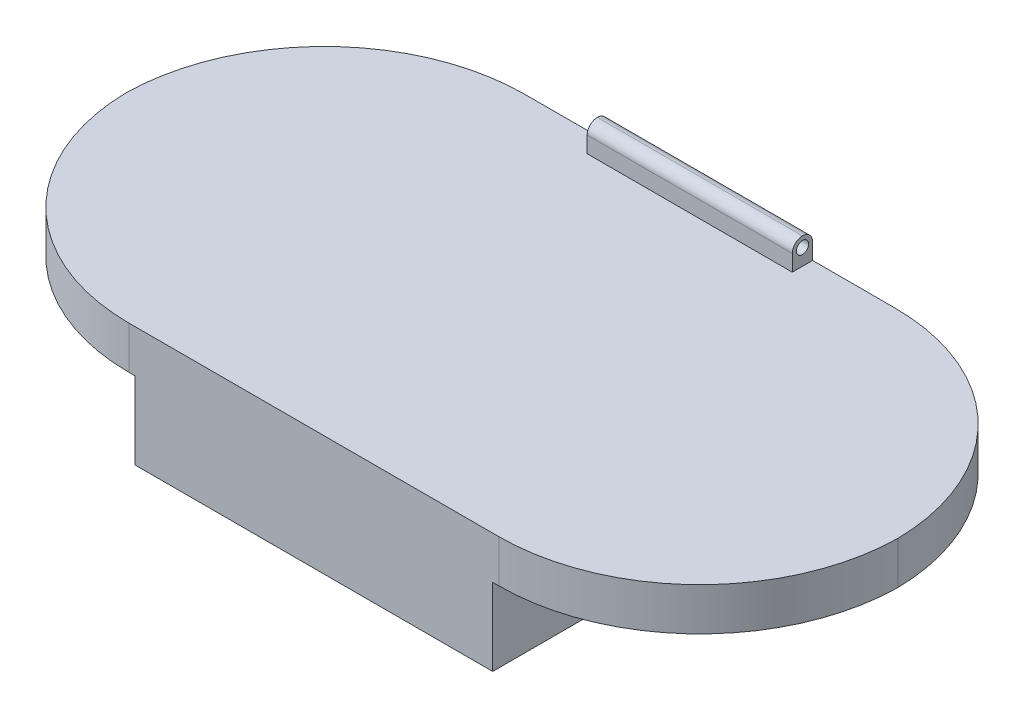
ISO-10303-21;
HEADER;
FILE_DESCRIPTION(('STEP AP214'),'2;1');
FILE_NAME('part.step','',(''),(''),'','','');
FILE_SCHEMA(('AUTOMOTIVE_DESIGN { 1 0 10303 214 1 1 1 1 }'));
ENDSEC;
DATA;
#1=APPLICATION_CONTEXT('core data for automotive mechanical design processes');
#2=APPLICATION_PROTOCOL_DEFINITION('international standard','automotive_design',2000,#1);
#3=PRODUCT_CONTEXT('',#1,'mechanical');
#4=PRODUCT('Part','Part','',(#3));
#5=PRODUCT_RELATED_PRODUCT_CATEGORY('part','',(#4));
#6=PRODUCT_DEFINITION_FORMATION('','',#4);
#7=PRODUCT_DEFINITION_CONTEXT('part definition',#1,'design');
#8=PRODUCT_DEFINITION('design','',#6,#7);
#9=PRODUCT_DEFINITION_SHAPE('','',#8);
#10=(LENGTH_UNIT() NAMED_UNIT(*) SI_UNIT(.MILLI.,.METRE.));
#11=(NAMED_UNIT(*) PLANE_ANGLE_UNIT() SI_UNIT($,.RADIAN.));
#12=(NAMED_UNIT(*) SI_UNIT($,.STERADIAN.) SOLID_ANGLE_UNIT());
#13=UNCERTAINTY_MEASURE_WITH_UNIT(LENGTH_MEASURE(1.E-05),#10,'distance_accuracy_value','');
#14=(GEOMETRIC_REPRESENTATION_CONTEXT(3) GLOBAL_UNCERTAINTY_ASSIGNED_CONTEXT((#13)) GLOBAL_UNIT_ASSIGNED_CONTEXT((#10,
#11,#12)) REPRESENTATION_CONTEXT('',''));
#15=CARTESIAN_POINT('',(0.,0.,0.));
#16=DIRECTION('',(0.,0.,1.));
#17=DIRECTION('',(1.,0.,0.));
#18=AXIS2_PLACEMENT_3D('',#15,#16,#17);
#19=CARTESIAN_POINT('',(0.,59.,0.));
#20=DIRECTION('',(0.,-1.,0.));
#21=DIRECTION('',(0.,0.,-1.));
#22=AXIS2_PLACEMENT_3D('',#19,#20,#21);
#23=PLANE('',#22);
#24=DIRECTION('',(0.,0.,1.));
#25=VECTOR('',#24,1.);
#26=CARTESIAN_POINT('',(-50.5,59.,-97.5));
#27=LINE('',#26,#25);
#28=CARTESIAN_POINT('',(-50.5,59.,-97.5));
#29=VERTEX_POINT('',#28);
#30=CARTESIAN_POINT('',(-50.5,59.,-87.5));
#31=VERTEX_POINT('',#30);
#32=EDGE_CURVE('E196',#29,#31,#27,.T.);
#33=ORIENTED_EDGE('',*,*,#32,.F.);
#34=DIRECTION('',(-1.,0.,0.));
#35=VECTOR('',#34,1.);
#36=CARTESIAN_POINT('',(190.,59.,-97.5));
#37=LINE('',#36,#35);
#38=CARTESIAN_POINT('',(-91.,59.,-97.5));
#39=VERTEX_POINT('',#38);
#40=EDGE_CURVE('E261',#29,#39,#37,.T.);
#41=ORIENTED_EDGE('',*,*,#40,.T.);
#42=CARTESIAN_POINT('',(-91.,59.,1.5));
#43=DIRECTION('',(0.,-1.,0.));
#44=DIRECTION('',(0.,0.,-1.));
#45=AXIS2_PLACEMENT_3D('',#42,#43,#44);
#46=CIRCLE('',#45,99.);
#47=CARTESIAN_POINT('',(-189.988635711378,59.,4.5775015722338E-13));
#48=VERTEX_POINT('',#47);
#49=EDGE_CURVE('E289',#39,#48,#46,.F.);
#50=ORIENTED_EDGE('',*,*,#49,.T.);
#51=CARTESIAN_POINT('',(-91.,59.,-1.5));
#52=DIRECTION('',(0.,-1.,0.));
#53=DIRECTION('',(0.,0.,-1.));
#54=AXIS2_PLACEMENT_3D('',#51,#52,#53);
#55=CIRCLE('',#54,99.);
#56=CARTESIAN_POINT('',(-91.,59.,97.5));
#57=VERTEX_POINT('',#56);
#58=EDGE_CURVE('E292',#48,#57,#55,.F.);
#59=ORIENTED_EDGE('',*,*,#58,.T.);
#60=DIRECTION('',(1.,0.,0.));
#61=VECTOR('',#60,1.);
#62=CARTESIAN_POINT('',(190.,59.,97.5));
#63=LINE('',#62,#61);
#64=CARTESIAN_POINT('',(91.,59.,97.5));
#65=VERTEX_POINT('',#64);
#66=EDGE_CURVE('E257',#57,#65,#63,.T.);
#67=ORIENTED_EDGE('',*,*,#66,.T.);
#68=CARTESIAN_POINT('',(91.,59.,-1.50000000000003));
#69=DIRECTION('',(0.,-1.,0.));
#70=DIRECTION('',(0.,0.,-1.));
#71=AXIS2_PLACEMENT_3D('',#68,#69,#70);
#72=CIRCLE('',#71,99.);
#73=CARTESIAN_POINT('',(189.988635711379,59.,0.));
#74=VERTEX_POINT('',#73);
#75=EDGE_CURVE('E283',#65,#74,#72,.F.);
#76=ORIENTED_EDGE('',*,*,#75,.T.);
#77=CARTESIAN_POINT('',(91.,59.,1.49999999999997));
#78=DIRECTION('',(0.,-1.,0.));
#79=DIRECTION('',(0.,0.,-1.));
#80=AXIS2_PLACEMENT_3D('',#77,#78,#79);
#81=CIRCLE('',#80,99.);
#82=CARTESIAN_POINT('',(91.,59.,-97.5));
#83=VERTEX_POINT('',#82);
#84=EDGE_CURVE('E286',#74,#83,#81,.F.);
#85=ORIENTED_EDGE('',*,*,#84,.T.);
#86=CARTESIAN_POINT('',(50.5,59.,-97.5));
#87=VERTEX_POINT('',#86);
#88=EDGE_CURVE('E189',#83,#87,#37,.T.);
#89=ORIENTED_EDGE('',*,*,#88,.T.);
#90=DIRECTION('',(0.,0.,-1.));
#91=VECTOR('',#90,1.);
#92=CARTESIAN_POINT('',(50.5,59.,-97.5));
#93=LINE('',#92,#91);
#94=CARTESIAN_POINT('',(50.5,59.,-87.5));
#95=VERTEX_POINT('',#94);
#96=EDGE_CURVE('E174',#95,#87,#93,.T.);
#97=ORIENTED_EDGE('',*,*,#96,.F.);
#98=DIRECTION('',(1.,0.,0.));
#99=VECTOR('',#98,1.);
#100=CARTESIAN_POINT('',(50.5,59.,-87.5));
#101=LINE('',#100,#99);
#102=EDGE_CURVE('E186',#31,#95,#101,.T.);
#103=ORIENTED_EDGE('',*,*,#102,.F.);
#104=EDGE_LOOP('',(#33,#41,#50,#59,#67,#76,#85,#89,#97,#103));
#105=FACE_BOUND('',#104,.T.);
#106=ADVANCED_FACE('F47',(#105),#23,.F.);
#107=CARTESIAN_POINT('',(190.,59.,97.5));
#108=DIRECTION('',(0.,0.,-1.));
#109=DIRECTION('',(-1.,0.,0.));
#110=AXIS2_PLACEMENT_3D('',#107,#108,#109);
#111=PLANE('',#110);
#112=ORIENTED_EDGE('',*,*,#66,.F.);
#113=DIRECTION('',(0.,-1.,0.));
#114=VECTOR('',#113,1.);
#115=CARTESIAN_POINT('',(-91.,59.,97.5));
#116=LINE('',#115,#114);
#117=CARTESIAN_POINT('',(-91.,38.,97.5));
#118=VERTEX_POINT('',#117);
#119=EDGE_CURVE('E273',#57,#118,#116,.T.);
#120=ORIENTED_EDGE('',*,*,#119,.T.);
#121=DIRECTION('',(-1.,0.,0.));
#122=VECTOR('',#121,1.);
#123=CARTESIAN_POINT('',(-88.0000000000001,38.,97.5));
#124=LINE('',#123,#122);
#125=CARTESIAN_POINT('',(-88.0000000000001,38.,97.5));
#126=VERTEX_POINT('',#125);
#127=EDGE_CURVE('E226',#126,#118,#124,.T.);
#128=ORIENTED_EDGE('',*,*,#127,.F.);
#129=DIRECTION('',(0.,-1.,0.));
#130=VECTOR('',#129,1.);
#131=CARTESIAN_POINT('',(-88.0000000000001,38.,97.5));
#132=LINE('',#131,#130);
#133=CARTESIAN_POINT('',(-88.0000000000001,0.,97.5));
#134=VERTEX_POINT('',#133);
#135=EDGE_CURVE('E210',#126,#134,#132,.T.);
#136=ORIENTED_EDGE('',*,*,#135,.T.);
#137=DIRECTION('',(1.,0.,0.));
#138=VECTOR('',#137,1.);
#139=CARTESIAN_POINT('',(190.,0.,97.5));
#140=LINE('',#139,#138);
#141=CARTESIAN_POINT('',(88.,0.,97.5));
#142=VERTEX_POINT('',#141);
#143=EDGE_CURVE('E253',#134,#142,#140,.T.);
#144=ORIENTED_EDGE('',*,*,#143,.T.);
#145=DIRECTION('',(0.,-1.,0.));
#146=VECTOR('',#145,1.);
#147=CARTESIAN_POINT('',(88.0000000000001,38.,97.5));
#148=LINE('',#147,#146);
#149=CARTESIAN_POINT('',(88.0000000000001,38.,97.5));
#150=VERTEX_POINT('',#149);
#151=EDGE_CURVE('E231',#150,#142,#148,.T.);
#152=ORIENTED_EDGE('',*,*,#151,.F.);
#153=DIRECTION('',(1.,0.,0.));
#154=VECTOR('',#153,1.);
#155=CARTESIAN_POINT('',(88.0000000000001,38.,97.5));
#156=LINE('',#155,#154);
#157=CARTESIAN_POINT('',(91.,38.,97.5));
#158=VERTEX_POINT('',#157);
#159=EDGE_CURVE('E249',#150,#158,#156,.T.);
#160=ORIENTED_EDGE('',*,*,#159,.T.);
#161=DIRECTION('',(0.,-1.,0.));
#162=VECTOR('',#161,1.);
#163=CARTESIAN_POINT('',(91.,59.,97.5));
#164=LINE('',#163,#162);
#165=EDGE_CURVE('E265',#158,#65,#164,.F.);
#166=ORIENTED_EDGE('',*,*,#165,.T.);
#167=EDGE_LOOP('',(#112,#120,#128,#136,#144,#152,#160,#166));
#168=FACE_BOUND('',#167,.T.);
#169=ADVANCED_FACE('F372',(#168),#111,.F.);
#170=CARTESIAN_POINT('',(190.,59.,-97.5));
#171=DIRECTION('',(0.,0.,1.));
#172=DIRECTION('',(1.,0.,0.));
#173=AXIS2_PLACEMENT_3D('',#170,#171,#172);
#174=PLANE('',#173);
#175=DIRECTION('',(0.,-1.,0.));
#176=VECTOR('',#175,1.);
#177=CARTESIAN_POINT('',(-50.5,72.,-97.5));
#178=LINE('',#177,#176);
#179=CARTESIAN_POINT('',(-50.5,67.,-97.5));
#180=VERTEX_POINT('',#179);
#181=EDGE_CURVE('E191',#180,#29,#178,.T.);
#182=ORIENTED_EDGE('',*,*,#181,.F.);
#183=DIRECTION('',(-1.,0.,0.));
#184=VECTOR('',#183,1.);
#185=CARTESIAN_POINT('',(190.,67.,-97.5));
#186=LINE('',#185,#184);
#187=CARTESIAN_POINT('',(50.5,67.,-97.5));
#188=VERTEX_POINT('',#187);
#189=EDGE_CURVE('E321',#180,#188,#186,.F.);
#190=ORIENTED_EDGE('',*,*,#189,.T.);
#191=DIRECTION('',(0.,-1.,0.));
#192=VECTOR('',#191,1.);
#193=CARTESIAN_POINT('',(50.5,72.,-97.5));
#194=LINE('',#193,#192);
#195=EDGE_CURVE('E180',#188,#87,#194,.T.);
#196=ORIENTED_EDGE('',*,*,#195,.T.);
#197=ORIENTED_EDGE('',*,*,#88,.F.);
#198=DIRECTION('',(0.,-1.,0.));
#199=VECTOR('',#198,1.);
#200=CARTESIAN_POINT('',(91.,59.,-97.5));
#201=LINE('',#200,#199);
#202=CARTESIAN_POINT('',(91.,38.,-97.5000000000001));
#203=VERTEX_POINT('',#202);
#204=EDGE_CURVE('E295',#83,#203,#201,.T.);
#205=ORIENTED_EDGE('',*,*,#204,.T.);
#206=DIRECTION('',(1.,0.,0.));
#207=VECTOR('',#206,1.);
#208=CARTESIAN_POINT('',(88.,38.,-97.5000000000001));
#209=LINE('',#208,#207);
#210=CARTESIAN_POINT('',(88.,38.,-97.5000000000001));
#211=VERTEX_POINT('',#210);
#212=EDGE_CURVE('E248',#211,#203,#209,.T.);
#213=ORIENTED_EDGE('',*,*,#212,.F.);
#214=DIRECTION('',(0.,1.,0.));
#215=VECTOR('',#214,1.);
#216=CARTESIAN_POINT('',(88.,38.,-97.5000000000001));
#217=LINE('',#216,#215);
#218=CARTESIAN_POINT('',(88.,0.,-97.5000000000001));
#219=VERTEX_POINT('',#218);
#220=EDGE_CURVE('E241',#219,#211,#217,.T.);
#221=ORIENTED_EDGE('',*,*,#220,.F.);
#222=DIRECTION('',(-1.,0.,0.));
#223=VECTOR('',#222,1.);
#224=CARTESIAN_POINT('',(190.,0.,-97.5));
#225=LINE('',#224,#223);
#226=CARTESIAN_POINT('',(-88.,0.,-97.5));
#227=VERTEX_POINT('',#226);
#228=EDGE_CURVE('E262',#219,#227,#225,.T.);
#229=ORIENTED_EDGE('',*,*,#228,.T.);
#230=DIRECTION('',(0.,1.,0.));
#231=VECTOR('',#230,1.);
#232=CARTESIAN_POINT('',(-88.,38.,-97.5000000000001));
#233=LINE('',#232,#231);
#234=CARTESIAN_POINT('',(-88.,38.,-97.5000000000001));
#235=VERTEX_POINT('',#234);
#236=EDGE_CURVE('E218',#227,#235,#233,.T.);
#237=ORIENTED_EDGE('',*,*,#236,.T.);
#238=DIRECTION('',(-1.,0.,0.));
#239=VECTOR('',#238,1.);
#240=CARTESIAN_POINT('',(-88.,38.,-97.5000000000001));
#241=LINE('',#240,#239);
#242=CARTESIAN_POINT('',(-91.,38.,-97.5000000000001));
#243=VERTEX_POINT('',#242);
#244=EDGE_CURVE('E227',#235,#243,#241,.T.);
#245=ORIENTED_EDGE('',*,*,#244,.T.);
#246=DIRECTION('',(0.,-1.,0.));
#247=VECTOR('',#246,1.);
#248=CARTESIAN_POINT('',(-91.,59.,-97.5));
#249=LINE('',#248,#247);
#250=EDGE_CURVE('E299',#243,#39,#249,.F.);
#251=ORIENTED_EDGE('',*,*,#250,.T.);
#252=ORIENTED_EDGE('',*,*,#40,.F.);
#253=EDGE_LOOP('',(#182,#190,#196,#197,#205,#213,#221,#229,#237,#245,#251,#252));
#254=FACE_BOUND('',#253,.T.);
#255=ADVANCED_FACE('F356',(#254),#174,.F.);
#256=CARTESIAN_POINT('',(0.,0.,0.));
#257=DIRECTION('',(0.,-1.,0.));
#258=DIRECTION('',(0.,0.,-1.));
#259=AXIS2_PLACEMENT_3D('',#256,#257,#258);
#260=PLANE('',#259);
#261=DIRECTION('',(0.,0.,-1.));
#262=VECTOR('',#261,1.);
#263=CARTESIAN_POINT('',(-88.,0.,-97.5000000000001));
#264=LINE('',#263,#262);
#265=EDGE_CURVE('E222',#134,#227,#264,.T.);
#266=ORIENTED_EDGE('',*,*,#265,.T.);
#267=ORIENTED_EDGE('',*,*,#228,.F.);
#268=DIRECTION('',(0.,0.,-1.));
#269=VECTOR('',#268,1.);
#270=CARTESIAN_POINT('',(88.,0.,-97.5000000000001));
#271=LINE('',#270,#269);
#272=EDGE_CURVE('E238',#142,#219,#271,.T.);
#273=ORIENTED_EDGE('',*,*,#272,.F.);
#274=ORIENTED_EDGE('',*,*,#143,.F.);
#275=EDGE_LOOP('',(#266,#267,#273,#274));
#276=FACE_BOUND('',#275,.T.);
#277=ADVANCED_FACE('F392',(#276),#260,.T.);
#278=CARTESIAN_POINT('',(88.,38.,-97.5000000000001));
#279=DIRECTION('',(0.,1.,0.));
#280=DIRECTION('',(0.,0.,1.));
#281=AXIS2_PLACEMENT_3D('',#278,#279,#280);
#282=PLANE('',#281);
#283=ORIENTED_EDGE('',*,*,#212,.T.);
#284=CARTESIAN_POINT('',(91.,38.,1.49999999999997));
#285=DIRECTION('',(0.,1.,0.));
#286=DIRECTION('',(0.,0.,1.));
#287=AXIS2_PLACEMENT_3D('',#284,#285,#286);
#288=CIRCLE('',#287,99.);
#289=CARTESIAN_POINT('',(189.988635711379,38.,0.));
#290=VERTEX_POINT('',#289);
#291=EDGE_CURVE('E306',#203,#290,#288,.F.);
#292=ORIENTED_EDGE('',*,*,#291,.T.);
#293=CARTESIAN_POINT('',(91.,38.,-1.50000000000003));
#294=DIRECTION('',(0.,1.,0.));
#295=DIRECTION('',(0.,0.,1.));
#296=AXIS2_PLACEMENT_3D('',#293,#294,#295);
#297=CIRCLE('',#296,99.);
#298=EDGE_CURVE('E303',#290,#158,#297,.F.);
#299=ORIENTED_EDGE('',*,*,#298,.T.);
#300=ORIENTED_EDGE('',*,*,#159,.F.);
#301=DIRECTION('',(0.,0.,1.));
#302=VECTOR('',#301,1.);
#303=CARTESIAN_POINT('',(88.,38.,-97.5000000000001));
#304=LINE('',#303,#302);
#305=EDGE_CURVE('E244',#211,#150,#304,.T.);
#306=ORIENTED_EDGE('',*,*,#305,.F.);
#307=EDGE_LOOP('',(#283,#292,#299,#300,#306));
#308=FACE_BOUND('',#307,.T.);
#309=ADVANCED_FACE('F385',(#308),#282,.F.);
#310=CARTESIAN_POINT('',(88.,0.,0.));
#311=DIRECTION('',(-1.,0.,0.));
#312=DIRECTION('',(0.,0.,1.));
#313=AXIS2_PLACEMENT_3D('',#310,#311,#312);
#314=PLANE('',#313);
#315=ORIENTED_EDGE('',*,*,#151,.T.);
#316=ORIENTED_EDGE('',*,*,#272,.T.);
#317=ORIENTED_EDGE('',*,*,#220,.T.);
#318=ORIENTED_EDGE('',*,*,#305,.T.);
#319=EDGE_LOOP('',(#315,#316,#317,#318));
#320=FACE_BOUND('',#319,.T.);
#321=ADVANCED_FACE('F401',(#320),#314,.F.);
#322=CARTESIAN_POINT('',(-88.,38.,-97.5000000000001));
#323=DIRECTION('',(0.,-1.,0.));
#324=DIRECTION('',(0.,0.,-1.));
#325=AXIS2_PLACEMENT_3D('',#322,#323,#324);
#326=PLANE('',#325);
#327=ORIENTED_EDGE('',*,*,#127,.T.);
#328=CARTESIAN_POINT('',(-91.,38.,-1.5));
#329=DIRECTION('',(0.,-1.,0.));
#330=DIRECTION('',(0.,0.,-1.));
#331=AXIS2_PLACEMENT_3D('',#328,#329,#330);
#332=CIRCLE('',#331,99.);
#333=CARTESIAN_POINT('',(-189.988635711378,38.,4.5775015722338E-13));
#334=VERTEX_POINT('',#333);
#335=EDGE_CURVE('E280',#118,#334,#332,.T.);
#336=ORIENTED_EDGE('',*,*,#335,.T.);
#337=CARTESIAN_POINT('',(-91.,38.,1.5));
#338=DIRECTION('',(0.,-1.,0.));
#339=DIRECTION('',(0.,0.,-1.));
#340=AXIS2_PLACEMENT_3D('',#337,#338,#339);
#341=CIRCLE('',#340,99.);
#342=EDGE_CURVE('E277',#334,#243,#341,.T.);
#343=ORIENTED_EDGE('',*,*,#342,.T.);
#344=ORIENTED_EDGE('',*,*,#244,.F.);
#345=DIRECTION('',(0.,0.,1.));
#346=VECTOR('',#345,1.);
#347=CARTESIAN_POINT('',(-88.,38.,-97.5000000000001));
#348=LINE('',#347,#346);
#349=EDGE_CURVE('E214',#235,#126,#348,.T.);
#350=ORIENTED_EDGE('',*,*,#349,.T.);
#351=EDGE_LOOP('',(#327,#336,#343,#344,#350));
#352=FACE_BOUND('',#351,.T.);
#353=ADVANCED_FACE('F399',(#352),#326,.T.);
#354=CARTESIAN_POINT('',(-88.,0.,0.));
#355=DIRECTION('',(1.,0.,0.));
#356=DIRECTION('',(0.,0.,1.));
#357=AXIS2_PLACEMENT_3D('',#354,#355,#356);
#358=PLANE('',#357);
#359=ORIENTED_EDGE('',*,*,#135,.F.);
#360=ORIENTED_EDGE('',*,*,#349,.F.);
#361=ORIENTED_EDGE('',*,*,#236,.F.);
#362=ORIENTED_EDGE('',*,*,#265,.F.);
#363=EDGE_LOOP('',(#359,#360,#361,#362));
#364=FACE_BOUND('',#363,.T.);
#365=ADVANCED_FACE('F396',(#364),#358,.F.);
#366=CARTESIAN_POINT('',(-91.,59.,1.5));
#367=DIRECTION('',(0.,-1.,0.));
#368=DIRECTION('',(0.,0.,-1.));
#369=AXIS2_PLACEMENT_3D('',#366,#367,#368);
#370=CYLINDRICAL_SURFACE('',#369,99.);
#371=DIRECTION('',(0.,-1.,0.));
#372=VECTOR('',#371,1.);
#373=CARTESIAN_POINT('',(-189.988635711378,48.5,4.5775015722338E-13));
#374=LINE('',#373,#372);
#375=EDGE_CURVE('E215',#48,#334,#374,.T.);
#376=ORIENTED_EDGE('',*,*,#375,.F.);
#377=ORIENTED_EDGE('',*,*,#49,.F.);
#378=ORIENTED_EDGE('',*,*,#250,.F.);
#379=ORIENTED_EDGE('',*,*,#342,.F.);
#380=EDGE_LOOP('',(#376,#377,#378,#379));
#381=FACE_BOUND('',#380,.T.);
#382=ADVANCED_FACE('F364',(#381),#370,.T.);
#383=CARTESIAN_POINT('',(-91.,59.,-1.5));
#384=DIRECTION('',(0.,-1.,0.));
#385=DIRECTION('',(0.,0.,-1.));
#386=AXIS2_PLACEMENT_3D('',#383,#384,#385);
#387=CYLINDRICAL_SURFACE('',#386,99.);
#388=ORIENTED_EDGE('',*,*,#58,.F.);
#389=ORIENTED_EDGE('',*,*,#375,.T.);
#390=ORIENTED_EDGE('',*,*,#335,.F.);
#391=ORIENTED_EDGE('',*,*,#119,.F.);
#392=EDGE_LOOP('',(#388,#389,#390,#391));
#393=FACE_BOUND('',#392,.T.);
#394=ADVANCED_FACE('F368',(#393),#387,.T.);
#395=CARTESIAN_POINT('',(91.,59.,-1.50000000000003));
#396=DIRECTION('',(0.,-1.,0.));
#397=DIRECTION('',(0.,0.,-1.));
#398=AXIS2_PLACEMENT_3D('',#395,#396,#397);
#399=CYLINDRICAL_SURFACE('',#398,99.);
#400=DIRECTION('',(0.,-1.,0.));
#401=VECTOR('',#400,1.);
#402=CARTESIAN_POINT('',(189.988635711379,48.5,0.));
#403=LINE('',#402,#401);
#404=EDGE_CURVE('E209',#74,#290,#403,.T.);
#405=ORIENTED_EDGE('',*,*,#404,.F.);
#406=ORIENTED_EDGE('',*,*,#75,.F.);
#407=ORIENTED_EDGE('',*,*,#165,.F.);
#408=ORIENTED_EDGE('',*,*,#298,.F.);
#409=EDGE_LOOP('',(#405,#406,#407,#408));
#410=FACE_BOUND('',#409,.T.);
#411=ADVANCED_FACE('F379',(#410),#399,.T.);
#412=CARTESIAN_POINT('',(91.,59.,1.49999999999997));
#413=DIRECTION('',(0.,-1.,0.));
#414=DIRECTION('',(0.,0.,-1.));
#415=AXIS2_PLACEMENT_3D('',#412,#413,#414);
#416=CYLINDRICAL_SURFACE('',#415,99.);
#417=ORIENTED_EDGE('',*,*,#84,.F.);
#418=ORIENTED_EDGE('',*,*,#404,.T.);
#419=ORIENTED_EDGE('',*,*,#291,.F.);
#420=ORIENTED_EDGE('',*,*,#204,.F.);
#421=EDGE_LOOP('',(#417,#418,#419,#420));
#422=FACE_BOUND('',#421,.T.);
#423=ADVANCED_FACE('F348',(#422),#416,.T.);
#424=CARTESIAN_POINT('',(-50.5,72.,-97.5));
#425=DIRECTION('',(1.,0.,0.));
#426=DIRECTION('',(0.,0.,-1.));
#427=AXIS2_PLACEMENT_3D('',#424,#425,#426);
#428=PLANE('',#427);
#429=CARTESIAN_POINT('',(-50.5,67.,-92.5));
#430=DIRECTION('',(-1.,0.,0.));
#431=DIRECTION('',(0.,0.,1.));
#432=AXIS2_PLACEMENT_3D('',#429,#430,#431);
#433=CIRCLE('',#432,3.00000000000001);
#434=CARTESIAN_POINT('',(-50.5,67.,-89.5));
#435=VERTEX_POINT('',#434);
#436=EDGE_CURVE('E335',#435,#435,#433,.T.);
#437=ORIENTED_EDGE('',*,*,#436,.F.);
#438=EDGE_LOOP('',(#437));
#439=FACE_BOUND('',#438,.T.);
#440=CARTESIAN_POINT('',(-50.5,67.,-92.5));
#441=DIRECTION('',(1.,0.,0.));
#442=DIRECTION('',(0.,0.,-1.));
#443=AXIS2_PLACEMENT_3D('',#440,#441,#442);
#444=CIRCLE('',#443,5.);
#445=CARTESIAN_POINT('',(-50.5,67.,-87.5));
#446=VERTEX_POINT('',#445);
#447=CARTESIAN_POINT('',(-50.5,72.,-92.5));
#448=VERTEX_POINT('',#447);
#449=EDGE_CURVE('E309',#446,#448,#444,.F.);
#450=ORIENTED_EDGE('',*,*,#449,.T.);
#451=CARTESIAN_POINT('',(-50.5,67.,-92.5));
#452=DIRECTION('',(1.,0.,0.));
#453=DIRECTION('',(0.,0.,-1.));
#454=AXIS2_PLACEMENT_3D('',#451,#452,#453);
#455=CIRCLE('',#454,5.);
#456=EDGE_CURVE('E318',#448,#180,#455,.F.);
#457=ORIENTED_EDGE('',*,*,#456,.T.);
#458=ORIENTED_EDGE('',*,*,#181,.T.);
#459=ORIENTED_EDGE('',*,*,#32,.T.);
#460=DIRECTION('',(0.,-1.,0.));
#461=VECTOR('',#460,1.);
#462=CARTESIAN_POINT('',(-50.5,72.,-87.5));
#463=LINE('',#462,#461);
#464=EDGE_CURVE('E179',#446,#31,#463,.T.);
#465=ORIENTED_EDGE('',*,*,#464,.F.);
#466=EDGE_LOOP('',(#450,#457,#458,#459,#465));
#467=FACE_BOUND('',#466,.T.);
#468=ADVANCED_FACE('F345',(#439,#467),#428,.F.);
#469=CARTESIAN_POINT('',(50.5,72.,-87.5));
#470=DIRECTION('',(0.,0.,-1.));
#471=DIRECTION('',(-1.,0.,0.));
#472=AXIS2_PLACEMENT_3D('',#469,#470,#471);
#473=PLANE('',#472);
#474=DIRECTION('',(0.,-1.,0.));
#475=VECTOR('',#474,1.);
#476=CARTESIAN_POINT('',(50.5,72.,-87.5));
#477=LINE('',#476,#475);
#478=CARTESIAN_POINT('',(50.5,67.,-87.5));
#479=VERTEX_POINT('',#478);
#480=EDGE_CURVE('E171',#479,#95,#477,.T.);
#481=ORIENTED_EDGE('',*,*,#480,.F.);
#482=DIRECTION('',(1.,0.,0.));
#483=VECTOR('',#482,1.);
#484=CARTESIAN_POINT('',(50.5,67.,-87.5));
#485=LINE('',#484,#483);
#486=EDGE_CURVE('E11',#479,#446,#485,.F.);
#487=ORIENTED_EDGE('',*,*,#486,.T.);
#488=ORIENTED_EDGE('',*,*,#464,.T.);
#489=ORIENTED_EDGE('',*,*,#102,.T.);
#490=EDGE_LOOP('',(#481,#487,#488,#489));
#491=FACE_BOUND('',#490,.T.);
#492=ADVANCED_FACE('F193',(#491),#473,.F.);
#493=CARTESIAN_POINT('',(50.5,72.,-97.5));
#494=DIRECTION('',(-1.,0.,0.));
#495=DIRECTION('',(0.,0.,1.));
#496=AXIS2_PLACEMENT_3D('',#493,#494,#495);
#497=PLANE('',#496);
#498=CARTESIAN_POINT('',(50.5,67.,-92.5));
#499=DIRECTION('',(-1.,0.,0.));
#500=DIRECTION('',(0.,0.,1.));
#501=AXIS2_PLACEMENT_3D('',#498,#499,#500);
#502=CIRCLE('',#501,3.00000000000001);
#503=CARTESIAN_POINT('',(50.5,67.,-89.5));
#504=VERTEX_POINT('',#503);
#505=EDGE_CURVE('E51',#504,#504,#502,.T.);
#506=ORIENTED_EDGE('',*,*,#505,.T.);
#507=EDGE_LOOP('',(#506));
#508=FACE_BOUND('',#507,.T.);
#509=ORIENTED_EDGE('',*,*,#195,.F.);
#510=CARTESIAN_POINT('',(50.5,67.,-92.5));
#511=DIRECTION('',(-1.,0.,0.));
#512=DIRECTION('',(0.,0.,1.));
#513=AXIS2_PLACEMENT_3D('',#510,#511,#512);
#514=CIRCLE('',#513,5.);
#515=CARTESIAN_POINT('',(50.5,72.,-92.5));
#516=VERTEX_POINT('',#515);
#517=EDGE_CURVE('E57',#188,#516,#514,.F.);
#518=ORIENTED_EDGE('',*,*,#517,.T.);
#519=CARTESIAN_POINT('',(50.5,67.,-92.5));
#520=DIRECTION('',(-1.,0.,0.));
#521=DIRECTION('',(0.,0.,1.));
#522=AXIS2_PLACEMENT_3D('',#519,#520,#521);
#523=CIRCLE('',#522,5.);
#524=EDGE_CURVE('E68',#516,#479,#523,.F.);
#525=ORIENTED_EDGE('',*,*,#524,.T.);
#526=ORIENTED_EDGE('',*,*,#480,.T.);
#527=ORIENTED_EDGE('',*,*,#96,.T.);
#528=EDGE_LOOP('',(#509,#518,#525,#526,#527));
#529=FACE_BOUND('',#528,.T.);
#530=ADVANCED_FACE('F173',(#508,#529),#497,.F.);
#531=CARTESIAN_POINT('',(0.,67.,-92.5));
#532=DIRECTION('',(1.,0.,0.));
#533=DIRECTION('',(0.,0.,-1.));
#534=AXIS2_PLACEMENT_3D('',#531,#532,#533);
#535=CYLINDRICAL_SURFACE('',#534,5.);
#536=ORIENTED_EDGE('',*,*,#486,.F.);
#537=ORIENTED_EDGE('',*,*,#524,.F.);
#538=DIRECTION('',(1.,0.,0.));
#539=VECTOR('',#538,1.);
#540=CARTESIAN_POINT('',(0.,72.,-92.5));
#541=LINE('',#540,#539);
#542=EDGE_CURVE('E199',#448,#516,#541,.T.);
#543=ORIENTED_EDGE('',*,*,#542,.F.);
#544=ORIENTED_EDGE('',*,*,#449,.F.);
#545=EDGE_LOOP('',(#536,#537,#543,#544));
#546=FACE_BOUND('',#545,.T.);
#547=ADVANCED_FACE('F49',(#546),#535,.T.);
#548=CARTESIAN_POINT('',(0.,67.,-92.5));
#549=DIRECTION('',(-1.,0.,0.));
#550=DIRECTION('',(0.,0.,1.));
#551=AXIS2_PLACEMENT_3D('',#548,#549,#550);
#552=CYLINDRICAL_SURFACE('',#551,5.);
#553=ORIENTED_EDGE('',*,*,#517,.F.);
#554=ORIENTED_EDGE('',*,*,#189,.F.);
#555=ORIENTED_EDGE('',*,*,#456,.F.);
#556=ORIENTED_EDGE('',*,*,#542,.T.);
#557=EDGE_LOOP('',(#553,#554,#555,#556));
#558=FACE_BOUND('',#557,.T.);
#559=ADVANCED_FACE('F354',(#558),#552,.T.);
#560=CARTESIAN_POINT('',(61.5,67.,-92.5));
#561=DIRECTION('',(-1.,0.,0.));
#562=DIRECTION('',(0.,0.,1.));
#563=AXIS2_PLACEMENT_3D('',#560,#561,#562);
#564=CYLINDRICAL_SURFACE('',#563,3.00000000000001);
#565=ORIENTED_EDGE('',*,*,#436,.T.);
#566=EDGE_LOOP('',(#565));
#567=FACE_BOUND('',#566,.T.);
#568=ORIENTED_EDGE('',*,*,#505,.F.);
#569=EDGE_LOOP('',(#568));
#570=FACE_BOUND('',#569,.T.);
#571=ADVANCED_FACE('F342',(#567,#570),#564,.F.);
#572=CLOSED_SHELL('',(#106,#169,#255,#277,#309,#321,#353,#365,#382,#394,#411,#423,#468,#492,
#530,#547,#559,#571));
#573=MANIFOLD_SOLID_BREP('B2',#572);
#574=ADVANCED_BREP_SHAPE_REPRESENTATION('',(#18,#573),#14);
#575=SHAPE_DEFINITION_REPRESENTATION(#9,#574);
ENDSEC;
END-ISO-10303-21;
